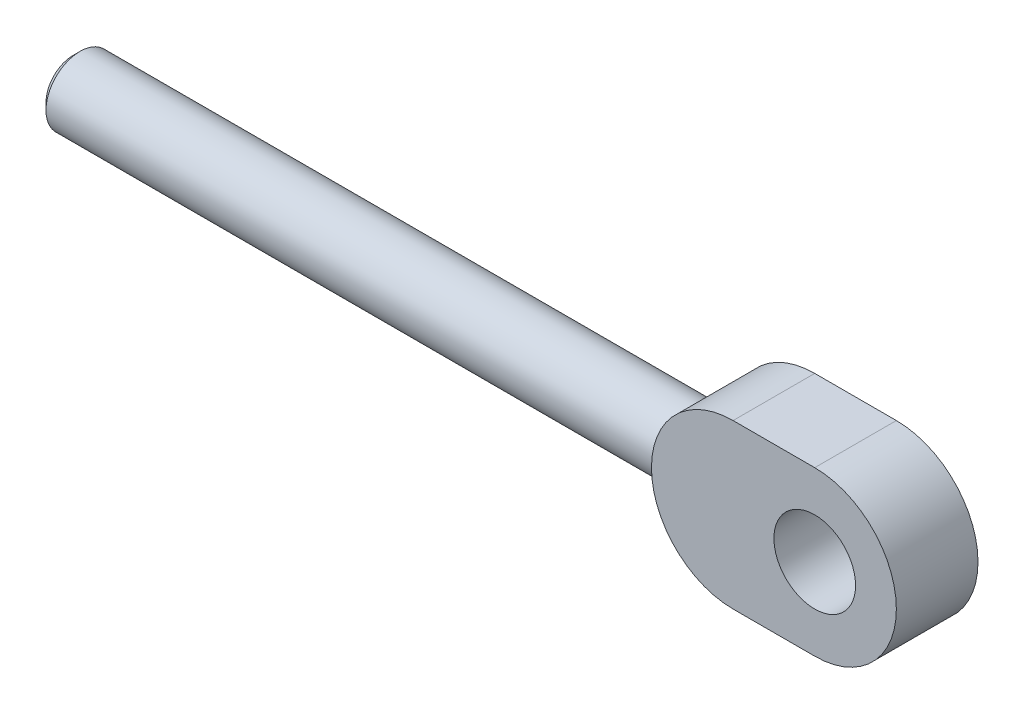
ISO-10303-21;
HEADER;
FILE_DESCRIPTION(('STEP AP214'),'2;1');
FILE_NAME('part.step','',(''),(''),'','','');
FILE_SCHEMA(('AUTOMOTIVE_DESIGN { 1 0 10303 214 1 1 1 1 }'));
ENDSEC;
DATA;
#1=APPLICATION_CONTEXT('core data for automotive mechanical design processes');
#2=APPLICATION_PROTOCOL_DEFINITION('international standard','automotive_design',2000,#1);
#3=PRODUCT_CONTEXT('',#1,'mechanical');
#4=PRODUCT('Part','Part','',(#3));
#5=PRODUCT_RELATED_PRODUCT_CATEGORY('part','',(#4));
#6=PRODUCT_DEFINITION_FORMATION('','',#4);
#7=PRODUCT_DEFINITION_CONTEXT('part definition',#1,'design');
#8=PRODUCT_DEFINITION('design','',#6,#7);
#9=PRODUCT_DEFINITION_SHAPE('','',#8);
#10=(LENGTH_UNIT() NAMED_UNIT(*) SI_UNIT(.MILLI.,.METRE.));
#11=(NAMED_UNIT(*) PLANE_ANGLE_UNIT() SI_UNIT($,.RADIAN.));
#12=(NAMED_UNIT(*) SI_UNIT($,.STERADIAN.) SOLID_ANGLE_UNIT());
#13=UNCERTAINTY_MEASURE_WITH_UNIT(LENGTH_MEASURE(1.E-05),#10,'distance_accuracy_value','');
#14=(GEOMETRIC_REPRESENTATION_CONTEXT(3) GLOBAL_UNCERTAINTY_ASSIGNED_CONTEXT((#13)) GLOBAL_UNIT_ASSIGNED_CONTEXT((#10,
#11,#12)) REPRESENTATION_CONTEXT('',''));
#15=CARTESIAN_POINT('',(0.,0.,0.));
#16=DIRECTION('',(0.,0.,1.));
#17=DIRECTION('',(1.,0.,0.));
#18=AXIS2_PLACEMENT_3D('',#15,#16,#17);
#19=CARTESIAN_POINT('',(-6.,0.,12.));
#20=DIRECTION('',(0.,0.,-1.));
#21=DIRECTION('',(-1.,0.,0.));
#22=AXIS2_PLACEMENT_3D('',#19,#20,#21);
#23=CYLINDRICAL_SURFACE('',#22,12.);
#24=CARTESIAN_POINT('',(-6.,0.,0.));
#25=DIRECTION('',(0.,0.,1.));
#26=DIRECTION('',(1.,0.,0.));
#27=AXIS2_PLACEMENT_3D('',#24,#25,#26);
#28=CIRCLE('',#27,12.);
#29=CARTESIAN_POINT('',(-6.,12.,0.));
#30=VERTEX_POINT('',#29);
#31=CARTESIAN_POINT('',(-6.,-12.,0.));
#32=VERTEX_POINT('',#31);
#33=EDGE_CURVE('E116',#30,#32,#28,.T.);
#34=ORIENTED_EDGE('',*,*,#33,.T.);
#35=DIRECTION('',(0.,0.,-1.));
#36=VECTOR('',#35,1.);
#37=CARTESIAN_POINT('',(-6.,-12.,12.));
#38=LINE('',#37,#36);
#39=CARTESIAN_POINT('',(-6.,-12.,12.));
#40=VERTEX_POINT('',#39);
#41=EDGE_CURVE('E105',#40,#32,#38,.T.);
#42=ORIENTED_EDGE('',*,*,#41,.F.);
#43=CARTESIAN_POINT('',(-6.,0.,12.));
#44=DIRECTION('',(0.,0.,1.));
#45=DIRECTION('',(1.,0.,0.));
#46=AXIS2_PLACEMENT_3D('',#43,#44,#45);
#47=CIRCLE('',#46,12.);
#48=CARTESIAN_POINT('',(-6.,12.,12.));
#49=VERTEX_POINT('',#48);
#50=EDGE_CURVE('E97',#49,#40,#47,.T.);
#51=ORIENTED_EDGE('',*,*,#50,.F.);
#52=DIRECTION('',(0.,0.,-1.));
#53=VECTOR('',#52,1.);
#54=CARTESIAN_POINT('',(-6.,12.,12.));
#55=LINE('',#54,#53);
#56=EDGE_CURVE('E112',#49,#30,#55,.T.);
#57=ORIENTED_EDGE('',*,*,#56,.T.);
#58=EDGE_LOOP('',(#34,#42,#51,#57));
#59=FACE_BOUND('',#58,.T.);
#60=CARTESIAN_POINT('',(-18.,0.,11.));
#61=CARTESIAN_POINT('',(-17.9999992729584,0.133971202199808,10.9999990914666));
#62=CARTESIAN_POINT('',(-17.9977503193947,0.267987722487516,10.9946081945841));
#63=CARTESIAN_POINT('',(-17.9888105832946,0.535066499257948,10.9730948474972));
#64=CARTESIAN_POINT('',(-17.9821169900031,0.668128097998224,10.956965606432));
#65=CARTESIAN_POINT('',(-17.9644464126044,0.932528423558352,10.9140981034186));
#66=CARTESIAN_POINT('',(-17.9534606492307,1.06386304519886,10.8873380952507));
#67=CARTESIAN_POINT('',(-17.927490817702,1.32363712069101,10.8234725282148));
#68=CARTESIAN_POINT('',(-17.9125051155232,1.45207536803167,10.7863627410574));
#69=CARTESIAN_POINT('',(-17.8789846295891,1.70466599018599,10.7023138952485));
#70=CARTESIAN_POINT('',(-17.8604636474237,1.82883288573376,10.6554129961059));
#71=CARTESIAN_POINT('',(-17.8202983493247,2.07264264011727,10.5521104896258));
#72=CARTESIAN_POINT('',(-17.7986528660016,2.19228378684376,10.4957053299424));
#73=CARTESIAN_POINT('',(-17.7298276864823,2.54317702528674,10.3129628809401));
#74=CARTESIAN_POINT('',(-17.6787121912958,2.76673759984579,10.1729849898133));
#75=CARTESIAN_POINT('',(-17.5683104696206,3.19782871405717,9.85347793484635));
#76=CARTESIAN_POINT('',(-17.5087569814802,3.40415336067112,9.67242892122495));
#77=CARTESIAN_POINT('',(-17.3893017107102,3.78465099990966,9.27890848656179));
#78=CARTESIAN_POINT('',(-17.3293997617084,3.95880706375339,9.06642062609308));
#79=CARTESIAN_POINT('',(-17.2426693606487,4.19642716763638,8.72227632929097));
#80=CARTESIAN_POINT('',(-17.213641472833,4.27318721758388,8.60014264272117));
#81=CARTESIAN_POINT('',(-17.158142646463,4.41607485285565,8.34927395874321));
#82=CARTESIAN_POINT('',(-17.1316706517088,4.48220683770539,8.22054172208642));
#83=CARTESIAN_POINT('',(-17.0821570819096,4.60326824362322,7.95727380138147));
#84=CARTESIAN_POINT('',(-17.0591156571702,4.65819717388443,7.82273786338529));
#85=CARTESIAN_POINT('',(-17.0172900479988,4.75627631879271,7.54886247889822));
#86=CARTESIAN_POINT('',(-16.9985036757451,4.79943258893619,7.40952554359407));
#87=CARTESIAN_POINT('',(-16.9666619504758,4.87173603809853,7.13380805072207));
#88=CARTESIAN_POINT('',(-16.9533759137281,4.90145340480219,6.99760365958737));
#89=CARTESIAN_POINT('',(-16.9317788095431,4.94943501929704,6.7228605983852));
#90=CARTESIAN_POINT('',(-16.9234654430414,4.96770456006234,6.58432303754408));
#91=CARTESIAN_POINT('',(-16.9121183161802,4.9925806714702,6.30602414623231));
#92=CARTESIAN_POINT('',(-16.9090831939376,4.99919025060126,6.16626314078902));
#93=CARTESIAN_POINT('',(-16.9084052474415,5.00066965421038,5.88666968828848));
#94=CARTESIAN_POINT('',(-16.9107621393462,4.99554009665008,5.74683724537918));
#95=CARTESIAN_POINT('',(-16.9203897344954,4.97445537231527,5.47901464805327));
#96=CARTESIAN_POINT('',(-16.9272683387031,4.95936366570947,5.35094126629261));
#97=CARTESIAN_POINT('',(-16.9453203456551,4.91939456846064,5.09659754142487));
#98=CARTESIAN_POINT('',(-16.9564951526574,4.89451397815816,4.97032780186761));
#99=CARTESIAN_POINT('',(-16.982791432776,4.83521901523602,4.72049574743192));
#100=CARTESIAN_POINT('',(-16.9979120065088,4.80080681510625,4.59693282252032));
#101=CARTESIAN_POINT('',(-17.0316484281794,4.72276746407085,4.35322571149799));
#102=CARTESIAN_POINT('',(-17.0502656234987,4.67913676011188,4.23308286389346));
#103=CARTESIAN_POINT('',(-17.1114348958982,4.53292198464472,3.87391306752255));
#104=CARTESIAN_POINT('',(-17.1587355468125,4.41623317355433,3.64125821268693));
#105=CARTESIAN_POINT('',(-17.2607369782698,4.14923538558579,3.19804915238382));
#106=CARTESIAN_POINT('',(-17.315440673762,3.99891315023541,2.98750371078817));
#107=CARTESIAN_POINT('',(-17.4317164413063,3.65399862437446,2.57561717753678));
#108=CARTESIAN_POINT('',(-17.4934782659376,3.4567386368719,2.37655771261506));
#109=CARTESIAN_POINT('',(-17.6130335162842,3.03087364970619,2.01352200039607));
#110=CARTESIAN_POINT('',(-17.6708260102514,2.80226132798022,1.84955397136795));
#111=CARTESIAN_POINT('',(-17.750564458423,2.43728165238545,1.63188502116149));
#112=CARTESIAN_POINT('',(-17.7762436004382,2.31032222862648,1.56341446300228));
#113=CARTESIAN_POINT('',(-17.8242558878425,2.05046026272765,1.43749802283573));
#114=CARTESIAN_POINT('',(-17.8465903904629,1.91756015985751,1.38004766623415));
#115=CARTESIAN_POINT('',(-17.8872573475038,1.64677309924856,1.27674472498626));
#116=CARTESIAN_POINT('',(-17.9055907244947,1.50888729966569,1.23088946638133));
#117=CARTESIAN_POINT('',(-17.9377129809443,1.22915368100483,1.15125570058601));
#118=CARTESIAN_POINT('',(-17.951502205588,1.08730616375715,1.11747627606863));
#119=CARTESIAN_POINT('',(-17.9733956498248,0.809887683545696,1.06413586262168));
#120=CARTESIAN_POINT('',(-17.981804303078,0.674487262769716,1.04381063945913));
#121=CARTESIAN_POINT('',(-17.9940291261992,0.402272400346697,1.01432893966274));
#122=CARTESIAN_POINT('',(-17.9978455472339,0.265458036446422,1.00517185220077));
#123=CARTESIAN_POINT('',(-18.0007785959499,-0.00847703491070476,0.998130654847332));
#124=CARTESIAN_POINT('',(-17.9998963609136,-0.145597660207643,1.00024381705729));
#125=CARTESIAN_POINT('',(-17.9934595362731,-0.419090564387007,1.01571255277727));
#126=CARTESIAN_POINT('',(-17.9879050505733,-0.555462859843406,1.02906787627665));
#127=CARTESIAN_POINT('',(-17.9726701367381,-0.819630607320875,1.06592509226874));
#128=CARTESIAN_POINT('',(-17.9632093877852,-0.947514514231336,1.08888750454916));
#129=CARTESIAN_POINT('',(-17.940444106674,-1.20082196325611,1.14460593564766));
#130=CARTESIAN_POINT('',(-17.9271383228689,-1.32624468997969,1.17736514366791));
#131=CARTESIAN_POINT('',(-17.8970094891313,-1.57375204172411,1.25236741168871));
#132=CARTESIAN_POINT('',(-17.8801874308528,-1.69583759693526,1.29460779807031));
#133=CARTESIAN_POINT('',(-17.8434257462031,-1.93599084783536,1.38821332811291));
#134=CARTESIAN_POINT('',(-17.8234849327137,-2.05405699265853,1.43958194734866));
#135=CARTESIAN_POINT('',(-17.7583467908549,-2.40829498205295,1.61023048200071));
#136=CARTESIAN_POINT('',(-17.7087843162294,-2.63698994915987,1.74377555233129));
#137=CARTESIAN_POINT('',(-17.6029475237576,-3.06942387949652,2.04423069860453));
#138=CARTESIAN_POINT('',(-17.5466704076328,-3.27315236592591,2.21115470470482));
#139=CARTESIAN_POINT('',(-17.4284863692559,-3.66531769677002,2.58759654117524));
#140=CARTESIAN_POINT('',(-17.3664645360616,-3.85162119447865,2.79930583321336));
#141=CARTESIAN_POINT('',(-17.2473669968315,-4.18670098676195,3.25213329340222));
#142=CARTESIAN_POINT('',(-17.1902924159789,-4.33546875898714,3.49325812184048));
#143=CARTESIAN_POINT('',(-17.1131825672233,-4.52791722204377,3.8742799790697));
#144=CARTESIAN_POINT('',(-17.0887445801545,-4.58727880369506,4.00557844323251));
#145=CARTESIAN_POINT('',(-17.0437261293759,-4.69462511155256,4.27336529062487));
#146=CARTESIAN_POINT('',(-17.0231439688385,-4.74261484462541,4.40985135899436));
#147=CARTESIAN_POINT('',(-16.9865909853451,-4.82668853878451,4.68697231949228));
#148=CARTESIAN_POINT('',(-16.9706180409148,-4.86277797828965,4.82760526998631));
#149=CARTESIAN_POINT('',(-16.9438843614028,-4.92264916938559,5.11195411229505));
#150=CARTESIAN_POINT('',(-16.9331231361237,-4.94643207850299,5.25566971283738));
#151=CARTESIAN_POINT('',(-16.9178575324529,-4.9800298567505,5.53376050190687));
#152=CARTESIAN_POINT('',(-16.9129342806299,-4.99078127149665,5.66800030408615));
#153=CARTESIAN_POINT('',(-16.9080644511076,-5.00141640257177,5.93704951835244));
#154=CARTESIAN_POINT('',(-16.9081195391098,-5.00129648146307,6.07185910599751));
#155=CARTESIAN_POINT('',(-16.9132080645731,-4.99018296923951,6.34086161118505));
#156=CARTESIAN_POINT('',(-16.9182388867303,-4.97919509044956,6.47505481548039));
#157=CARTESIAN_POINT('',(-16.933099505538,-4.94647921783658,6.74190431694874));
#158=CARTESIAN_POINT('',(-16.9429311109705,-4.92474717591724,6.87456001553816));
#159=CARTESIAN_POINT('',(-16.966489611938,-4.87205259520336,7.13112051872266));
#160=CARTESIAN_POINT('',(-16.9800115342469,-4.84157230887098,7.25514344248263));
#161=CARTESIAN_POINT('',(-17.0106991045504,-4.77136925956337,7.50009782053464));
#162=CARTESIAN_POINT('',(-17.0278660096413,-4.73164330745016,7.62102819209136));
#163=CARTESIAN_POINT('',(-17.0841175717513,-4.59908761582495,7.97806154942845));
#164=CARTESIAN_POINT('',(-17.1279707524951,-4.49284253561317,8.20858725560768));
#165=CARTESIAN_POINT('',(-17.226679213664,-4.24040889849447,8.66281560601065));
#166=CARTESIAN_POINT('',(-17.2820374827937,-4.09220273518373,8.88527455471094));
#167=CARTESIAN_POINT('',(-17.396154190208,-3.76270798192949,9.3034553285329));
#168=CARTESIAN_POINT('',(-17.4549138026364,-3.58140792090314,9.49916784148204));
#169=CARTESIAN_POINT('',(-17.5433831914863,-3.28060198965565,9.77598911234327));
#170=CARTESIAN_POINT('',(-17.5739466268846,-3.17135125699736,9.8682042514757));
#171=CARTESIAN_POINT('',(-17.6335718153871,-2.94510913832992,10.0431112048865));
#172=CARTESIAN_POINT('',(-17.6626340992841,-2.82812052219569,10.1258063982126));
#173=CARTESIAN_POINT('',(-17.7184848881627,-2.58697642479179,10.281138652427));
#174=CARTESIAN_POINT('',(-17.7452712553474,-2.46281438535245,10.3537662962983));
#175=CARTESIAN_POINT('',(-17.7957806454889,-2.2082535237545,10.4882427852065));
#176=CARTESIAN_POINT('',(-17.8195050794223,-2.0778576124778,10.5500965995833));
#177=CARTESIAN_POINT('',(-17.8628724264483,-1.81380017769054,10.6615810427001));
#178=CARTESIAN_POINT('',(-17.8825746428453,-1.68022444756869,10.7113916311525));
#179=CARTESIAN_POINT('',(-17.9177941454219,-1.40886045780292,10.7995260141615));
#180=CARTESIAN_POINT('',(-17.9333134162086,-1.27107423050946,10.8378552570306));
#181=CARTESIAN_POINT('',(-17.959688566513,-0.992651980203957,10.9025525244881));
#182=CARTESIAN_POINT('',(-17.9705559590045,-0.85202390542895,10.9289500880649));
#183=CARTESIAN_POINT('',(-17.9873498855457,-0.56880246605397,10.9695979090313));
#184=CARTESIAN_POINT('',(-17.9932800463356,-0.426210622389144,10.9838570830855));
#185=CARTESIAN_POINT('',(-17.9977699594236,-0.236110915428314,10.9946457709799));
#186=CARTESIAN_POINT('',(-17.9986057728967,-0.188916808355247,10.9966530624495));
#187=CARTESIAN_POINT('',(-17.9997209221766,-0.0944836795338212,10.9993303390705));
#188=CARTESIAN_POINT('',(-18.0000002563897,-0.047244657657232,11.0000003203923));
#189=CARTESIAN_POINT('',(-18.,0.,11.));
#190=B_SPLINE_CURVE_WITH_KNOTS('',3,(#60,#61,#62,#63,#64,#65,#66,#67,#68,#69,#70,#71,#72,#73,
#74,#75,#76,#77,#78,#79,#80,#81,#82,#83,#84,#85,#86,#87,#88,#89,#90,#91,#92,#93,#94,#95,#96,#97,
#98,#99,#100,#101,#102,#103,#104,#105,#106,#107,#108,#109,#110,#111,#112,#113,#114,#115,#116,
#117,#118,#119,#120,#121,#122,#123,#124,#125,#126,#127,#128,#129,#130,#131,#132,#133,#134,#135,
#136,#137,#138,#139,#140,#141,#142,#143,#144,#145,#146,#147,#148,#149,#150,#151,#152,#153,#154,
#155,#156,#157,#158,#159,#160,#161,#162,#163,#164,#165,#166,#167,#168,#169,#170,#171,#172,#173,
#174,#175,#176,#177,#178,#179,#180,#181,#182,#183,#184,#185,#186,#187,#188,#189),.UNSPECIFIED.,
.T.,.F.,(4,2,2,2,2,2,2,2,2,2,2,2,2,2,2,2,2,2,2,2,2,2,2,2,2,2,2,2,2,2,2,2,2,2,2,2,2,2,2,2,2,2,2,
2,2,2,2,2,2,2,2,2,2,2,2,2,2,2,2,2,2,2,2,2,4),(0.,0.401865511192765,0.803985401292742,
1.20693213583696,1.61004373163513,2.01161264408377,2.41333198262602,3.21570232241271,
4.05488202655309,4.89450210025943,5.33547541815659,5.77626572075065,6.21707533026384,
6.657657771416,7.07721787938552,7.49658385769289,7.91584161588806,8.33507730438084,
8.72205078978925,9.10915086914488,9.49616279130697,9.88332415102037,10.6733254842805,
11.4636387906201,12.3207426070477,13.1780469345154,13.6171124056289,14.0559992214016,
14.4947847324951,14.9335369046603,15.3445355807386,15.755511776716,16.1663885028034,
16.5772560917832,16.9676245545711,17.3581202346347,17.7485059359724,18.1390405964013,
18.9435709432164,19.7484377511098,20.6108250535017,21.4734079819436,21.911378276108,
22.3491553782635,22.7867306630771,23.2242647829867,23.6280231699892,24.0319166509118,
24.435597953478,24.8394314677676,25.2242700123875,25.609241497888,26.3786352973221,
27.1942912351952,28.0102304363353,28.4483841335548,28.8863818280895,29.3247864929416,
29.7629884086909,30.1941695396216,30.6251457342279,31.0550490470869,31.4846362867339,
31.6263528931453,31.7680699053748),.UNSPECIFIED.);
#191=CARTESIAN_POINT('',(-18.,0.,11.));
#192=VERTEX_POINT('',#191);
#193=EDGE_CURVE('E133',#192,#192,#190,.T.);
#194=ORIENTED_EDGE('',*,*,#193,.F.);
#195=EDGE_LOOP('',(#194));
#196=FACE_BOUND('',#195,.T.);
#197=ADVANCED_FACE('F41',(#59,#196),#23,.T.);
#198=CARTESIAN_POINT('',(-6.,0.,12.));
#199=DIRECTION('',(0.,0.,1.));
#200=DIRECTION('',(1.,0.,0.));
#201=AXIS2_PLACEMENT_3D('',#198,#199,#200);
#202=PLANE('',#201);
#203=ORIENTED_EDGE('',*,*,#50,.T.);
#204=DIRECTION('',(1.,0.,0.));
#205=VECTOR('',#204,1.);
#206=CARTESIAN_POINT('',(-6.,-12.,12.));
#207=LINE('',#206,#205);
#208=CARTESIAN_POINT('',(6.,-12.,12.));
#209=VERTEX_POINT('',#208);
#210=EDGE_CURVE('E91',#40,#209,#207,.T.);
#211=ORIENTED_EDGE('',*,*,#210,.T.);
#212=CARTESIAN_POINT('',(6.,0.,12.));
#213=DIRECTION('',(0.,0.,1.));
#214=DIRECTION('',(1.,0.,0.));
#215=AXIS2_PLACEMENT_3D('',#212,#213,#214);
#216=CIRCLE('',#215,12.);
#217=CARTESIAN_POINT('',(5.99999999999999,12.,12.));
#218=VERTEX_POINT('',#217);
#219=EDGE_CURVE('E95',#209,#218,#216,.T.);
#220=ORIENTED_EDGE('',*,*,#219,.T.);
#221=DIRECTION('',(-1.,0.,0.));
#222=VECTOR('',#221,1.);
#223=CARTESIAN_POINT('',(-6.,12.,12.));
#224=LINE('',#223,#222);
#225=EDGE_CURVE('E60',#218,#49,#224,.T.);
#226=ORIENTED_EDGE('',*,*,#225,.T.);
#227=EDGE_LOOP('',(#203,#211,#220,#226));
#228=FACE_BOUND('',#227,.T.);
#229=CARTESIAN_POINT('',(6.,0.,12.));
#230=DIRECTION('',(0.,0.,1.));
#231=DIRECTION('',(1.,0.,0.));
#232=AXIS2_PLACEMENT_3D('',#229,#230,#231);
#233=CIRCLE('',#232,6.);
#234=CARTESIAN_POINT('',(12.,0.,12.));
#235=VERTEX_POINT('',#234);
#236=EDGE_CURVE('E120',#235,#235,#233,.T.);
#237=ORIENTED_EDGE('',*,*,#236,.F.);
#238=EDGE_LOOP('',(#237));
#239=FACE_BOUND('',#238,.T.);
#240=ADVANCED_FACE('F92',(#228,#239),#202,.T.);
#241=CARTESIAN_POINT('',(-6.,0.,0.));
#242=DIRECTION('',(0.,0.,1.));
#243=DIRECTION('',(1.,0.,0.));
#244=AXIS2_PLACEMENT_3D('',#241,#242,#243);
#245=PLANE('',#244);
#246=ORIENTED_EDGE('',*,*,#33,.F.);
#247=DIRECTION('',(-1.,0.,0.));
#248=VECTOR('',#247,1.);
#249=CARTESIAN_POINT('',(-6.,12.,0.));
#250=LINE('',#249,#248);
#251=CARTESIAN_POINT('',(5.99999999999999,12.,0.));
#252=VERTEX_POINT('',#251);
#253=EDGE_CURVE('E83',#252,#30,#250,.T.);
#254=ORIENTED_EDGE('',*,*,#253,.F.);
#255=CARTESIAN_POINT('',(6.,0.,0.));
#256=DIRECTION('',(0.,0.,1.));
#257=DIRECTION('',(1.,0.,0.));
#258=AXIS2_PLACEMENT_3D('',#255,#256,#257);
#259=CIRCLE('',#258,12.);
#260=CARTESIAN_POINT('',(6.,-12.,0.));
#261=VERTEX_POINT('',#260);
#262=EDGE_CURVE('E77',#261,#252,#259,.T.);
#263=ORIENTED_EDGE('',*,*,#262,.F.);
#264=DIRECTION('',(1.,0.,0.));
#265=VECTOR('',#264,1.);
#266=CARTESIAN_POINT('',(-6.,-12.,0.));
#267=LINE('',#266,#265);
#268=EDGE_CURVE('E103',#32,#261,#267,.T.);
#269=ORIENTED_EDGE('',*,*,#268,.F.);
#270=EDGE_LOOP('',(#246,#254,#263,#269));
#271=FACE_BOUND('',#270,.T.);
#272=CARTESIAN_POINT('',(6.,0.,0.));
#273=DIRECTION('',(0.,0.,1.));
#274=DIRECTION('',(1.,0.,0.));
#275=AXIS2_PLACEMENT_3D('',#272,#273,#274);
#276=CIRCLE('',#275,6.);
#277=CARTESIAN_POINT('',(12.,0.,0.));
#278=VERTEX_POINT('',#277);
#279=EDGE_CURVE('E177',#278,#278,#276,.T.);
#280=ORIENTED_EDGE('',*,*,#279,.T.);
#281=EDGE_LOOP('',(#280));
#282=FACE_BOUND('',#281,.T.);
#283=ADVANCED_FACE('F156',(#271,#282),#245,.F.);
#284=CARTESIAN_POINT('',(-6.,-12.,12.));
#285=DIRECTION('',(0.,1.,0.));
#286=DIRECTION('',(-1.,0.,0.));
#287=AXIS2_PLACEMENT_3D('',#284,#285,#286);
#288=PLANE('',#287);
#289=ORIENTED_EDGE('',*,*,#268,.T.);
#290=DIRECTION('',(0.,0.,-1.));
#291=VECTOR('',#290,1.);
#292=CARTESIAN_POINT('',(6.,-12.,12.));
#293=LINE('',#292,#291);
#294=EDGE_CURVE('E101',#209,#261,#293,.T.);
#295=ORIENTED_EDGE('',*,*,#294,.F.);
#296=ORIENTED_EDGE('',*,*,#210,.F.);
#297=ORIENTED_EDGE('',*,*,#41,.T.);
#298=EDGE_LOOP('',(#289,#295,#296,#297));
#299=FACE_BOUND('',#298,.T.);
#300=ADVANCED_FACE('F102',(#299),#288,.F.);
#301=CARTESIAN_POINT('',(6.,0.,12.));
#302=DIRECTION('',(0.,0.,-1.));
#303=DIRECTION('',(-1.,0.,0.));
#304=AXIS2_PLACEMENT_3D('',#301,#302,#303);
#305=CYLINDRICAL_SURFACE('',#304,12.);
#306=ORIENTED_EDGE('',*,*,#262,.T.);
#307=DIRECTION('',(0.,0.,-1.));
#308=VECTOR('',#307,1.);
#309=CARTESIAN_POINT('',(5.99999999999999,12.,12.));
#310=LINE('',#309,#308);
#311=EDGE_CURVE('E106',#218,#252,#310,.T.);
#312=ORIENTED_EDGE('',*,*,#311,.F.);
#313=ORIENTED_EDGE('',*,*,#219,.F.);
#314=ORIENTED_EDGE('',*,*,#294,.T.);
#315=EDGE_LOOP('',(#306,#312,#313,#314));
#316=FACE_BOUND('',#315,.T.);
#317=ADVANCED_FACE('F108',(#316),#305,.T.);
#318=CARTESIAN_POINT('',(-6.,12.,12.));
#319=DIRECTION('',(0.,-1.,0.));
#320=DIRECTION('',(1.,0.,0.));
#321=AXIS2_PLACEMENT_3D('',#318,#319,#320);
#322=PLANE('',#321);
#323=ORIENTED_EDGE('',*,*,#253,.T.);
#324=ORIENTED_EDGE('',*,*,#56,.F.);
#325=ORIENTED_EDGE('',*,*,#225,.F.);
#326=ORIENTED_EDGE('',*,*,#311,.T.);
#327=EDGE_LOOP('',(#323,#324,#325,#326));
#328=FACE_BOUND('',#327,.T.);
#329=ADVANCED_FACE('F152',(#328),#322,.F.);
#330=CARTESIAN_POINT('',(6.,0.,12.));
#331=DIRECTION('',(0.,0.,-1.));
#332=DIRECTION('',(-1.,0.,0.));
#333=AXIS2_PLACEMENT_3D('',#330,#331,#332);
#334=CYLINDRICAL_SURFACE('',#333,6.);
#335=ORIENTED_EDGE('',*,*,#236,.T.);
#336=EDGE_LOOP('',(#335));
#337=FACE_BOUND('',#336,.T.);
#338=ORIENTED_EDGE('',*,*,#279,.F.);
#339=EDGE_LOOP('',(#338));
#340=FACE_BOUND('',#339,.T.);
#341=ADVANCED_FACE('F148',(#337,#340),#334,.F.);
#342=CARTESIAN_POINT('',(18.001,0.,6.));
#343=DIRECTION('',(-1.,0.,0.));
#344=DIRECTION('',(0.,0.,1.));
#345=AXIS2_PLACEMENT_3D('',#342,#343,#344);
#346=CYLINDRICAL_SURFACE('',#345,5.);
#347=CARTESIAN_POINT('',(-108.,0.,6.));
#348=DIRECTION('',(1.,0.,0.));
#349=DIRECTION('',(0.,0.,-1.));
#350=AXIS2_PLACEMENT_3D('',#347,#348,#349);
#351=CIRCLE('',#350,5.);
#352=CARTESIAN_POINT('',(-108.,0.,0.999999999999998));
#353=VERTEX_POINT('',#352);
#354=EDGE_CURVE('E52',#353,#353,#351,.T.);
#355=ORIENTED_EDGE('',*,*,#354,.T.);
#356=EDGE_LOOP('',(#355));
#357=FACE_BOUND('',#356,.T.);
#358=ORIENTED_EDGE('',*,*,#193,.T.);
#359=EDGE_LOOP('',(#358));
#360=FACE_BOUND('',#359,.T.);
#361=ADVANCED_FACE('F142',(#357,#360),#346,.T.);
#362=CARTESIAN_POINT('',(-109.,0.,6.));
#363=DIRECTION('',(1.,0.,0.));
#364=DIRECTION('',(0.,0.,-1.));
#365=AXIS2_PLACEMENT_3D('',#362,#363,#364);
#366=PLANE('',#365);
#367=CARTESIAN_POINT('',(-109.,0.,6.));
#368=DIRECTION('',(1.,0.,0.));
#369=DIRECTION('',(0.,0.,-1.));
#370=AXIS2_PLACEMENT_3D('',#367,#368,#369);
#371=CIRCLE('',#370,3.99999999999999);
#372=CARTESIAN_POINT('',(-109.,0.,2.00000000000001));
#373=VERTEX_POINT('',#372);
#374=EDGE_CURVE('E11',#373,#373,#371,.F.);
#375=ORIENTED_EDGE('',*,*,#374,.T.);
#376=EDGE_LOOP('',(#375));
#377=FACE_BOUND('',#376,.T.);
#378=ADVANCED_FACE('F147',(#377),#366,.F.);
#379=CARTESIAN_POINT('',(-108.,0.,6.));
#380=DIRECTION('',(1.,0.,0.));
#381=DIRECTION('',(0.,0.,-1.));
#382=AXIS2_PLACEMENT_3D('',#379,#380,#381);
#383=CONICAL_SURFACE('',#382,5.,0.785398163397439);
#384=ORIENTED_EDGE('',*,*,#374,.F.);
#385=EDGE_LOOP('',(#384));
#386=FACE_BOUND('',#385,.T.);
#387=ORIENTED_EDGE('',*,*,#354,.F.);
#388=EDGE_LOOP('',(#387));
#389=FACE_BOUND('',#388,.T.);
#390=ADVANCED_FACE('F44',(#386,#389),#383,.T.);
#391=CLOSED_SHELL('',(#197,#240,#283,#300,#317,#329,#341,#361,#378,#390));
#392=MANIFOLD_SOLID_BREP('B2',#391);
#393=ADVANCED_BREP_SHAPE_REPRESENTATION('',(#18,#392),#14);
#394=SHAPE_DEFINITION_REPRESENTATION(#9,#393);
ENDSEC;
END-ISO-10303-21;
